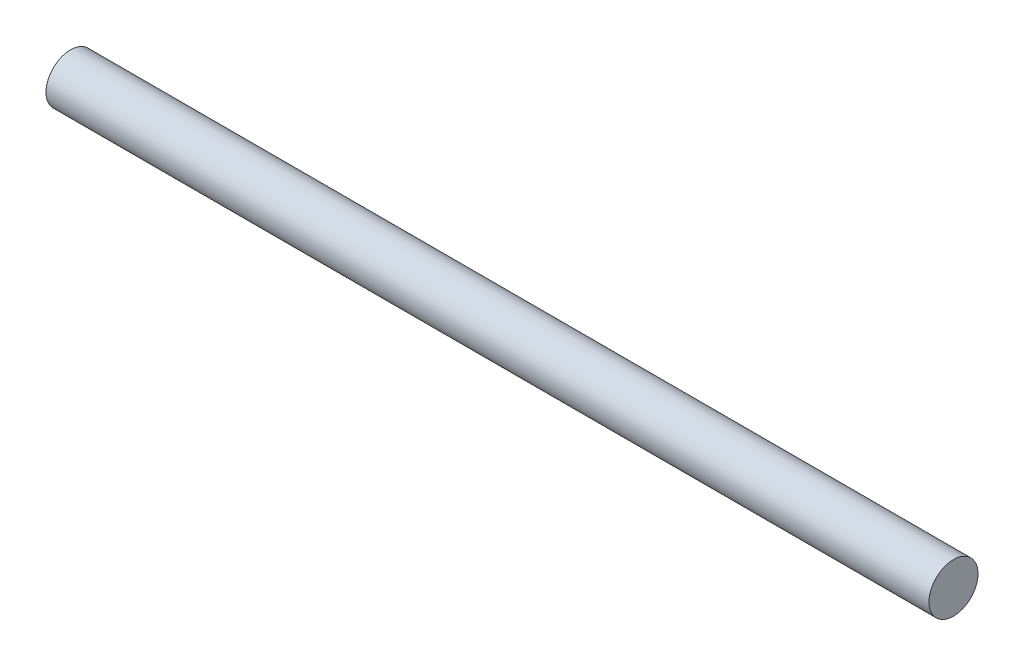
ISO-10303-21;
HEADER;
FILE_DESCRIPTION(('STEP AP214'),'2;1');
FILE_NAME('part.step','',(''),(''),'','','');
FILE_SCHEMA(('AUTOMOTIVE_DESIGN { 1 0 10303 214 1 1 1 1 }'));
ENDSEC;
DATA;
#1=APPLICATION_CONTEXT('core data for automotive mechanical design processes');
#2=APPLICATION_PROTOCOL_DEFINITION('international standard','automotive_design',2000,#1);
#3=PRODUCT_CONTEXT('',#1,'mechanical');
#4=PRODUCT('Part','Part','',(#3));
#5=PRODUCT_RELATED_PRODUCT_CATEGORY('part','',(#4));
#6=PRODUCT_DEFINITION_FORMATION('','',#4);
#7=PRODUCT_DEFINITION_CONTEXT('part definition',#1,'design');
#8=PRODUCT_DEFINITION('design','',#6,#7);
#9=PRODUCT_DEFINITION_SHAPE('','',#8);
#10=(LENGTH_UNIT() NAMED_UNIT(*) SI_UNIT(.MILLI.,.METRE.));
#11=(NAMED_UNIT(*) PLANE_ANGLE_UNIT() SI_UNIT($,.RADIAN.));
#12=(NAMED_UNIT(*) SI_UNIT($,.STERADIAN.) SOLID_ANGLE_UNIT());
#13=UNCERTAINTY_MEASURE_WITH_UNIT(LENGTH_MEASURE(1.E-05),#10,'distance_accuracy_value','');
#14=(GEOMETRIC_REPRESENTATION_CONTEXT(3) GLOBAL_UNCERTAINTY_ASSIGNED_CONTEXT((#13)) GLOBAL_UNIT_ASSIGNED_CONTEXT((#10,
#11,#12)) REPRESENTATION_CONTEXT('',''));
#15=CARTESIAN_POINT('',(0.,0.,0.));
#16=DIRECTION('',(0.,0.,1.));
#17=DIRECTION('',(1.,0.,0.));
#18=AXIS2_PLACEMENT_3D('',#15,#16,#17);
#19=CARTESIAN_POINT('',(90.,0.,0.));
#20=DIRECTION('',(-1.,0.,0.));
#21=DIRECTION('',(0.,0.,1.));
#22=AXIS2_PLACEMENT_3D('',#19,#20,#21);
#23=CYLINDRICAL_SURFACE('',#22,2.5);
#24=CARTESIAN_POINT('',(90.,0.,0.));
#25=DIRECTION('',(1.,0.,0.));
#26=DIRECTION('',(0.,0.,-1.));
#27=AXIS2_PLACEMENT_3D('',#24,#25,#26);
#28=CIRCLE('',#27,2.5);
#29=CARTESIAN_POINT('',(90.,0.,2.5));
#30=VERTEX_POINT('',#29);
#31=EDGE_CURVE('E10',#30,#30,#28,.T.);
#32=CARTESIAN_POINT('',(0.,0.,0.));
#33=DIRECTION('',(1.,0.,0.));
#34=DIRECTION('',(0.,0.,-1.));
#35=AXIS2_PLACEMENT_3D('',#32,#33,#34);
#36=CIRCLE('',#35,2.5);
#37=CARTESIAN_POINT('',(0.,0.,2.5));
#38=VERTEX_POINT('',#37);
#39=EDGE_CURVE('E34',#38,#38,#36,.T.);
#40=CARTESIAN_POINT('',(90.,0.,2.5));
#41=CARTESIAN_POINT('',(89.0625,0.,2.5));
#42=CARTESIAN_POINT('',(88.125,0.,2.5));
#43=CARTESIAN_POINT('',(86.25,0.,2.5));
#44=CARTESIAN_POINT('',(85.3125,0.,2.5));
#45=CARTESIAN_POINT('',(83.4375,0.,2.5));
#46=CARTESIAN_POINT('',(82.5,0.,2.5));
#47=CARTESIAN_POINT('',(80.625,0.,2.5));
#48=CARTESIAN_POINT('',(79.6875,0.,2.5));
#49=CARTESIAN_POINT('',(77.8125,0.,2.5));
#50=CARTESIAN_POINT('',(76.875,0.,2.5));
#51=CARTESIAN_POINT('',(75.,0.,2.5));
#52=CARTESIAN_POINT('',(74.0625,0.,2.5));
#53=CARTESIAN_POINT('',(72.1875,0.,2.5));
#54=CARTESIAN_POINT('',(71.25,0.,2.5));
#55=CARTESIAN_POINT('',(69.375,0.,2.5));
#56=CARTESIAN_POINT('',(68.4375,0.,2.5));
#57=CARTESIAN_POINT('',(66.5625,0.,2.5));
#58=CARTESIAN_POINT('',(65.625,0.,2.5));
#59=CARTESIAN_POINT('',(63.75,0.,2.5));
#60=CARTESIAN_POINT('',(62.8125,0.,2.5));
#61=CARTESIAN_POINT('',(60.9375,0.,2.5));
#62=CARTESIAN_POINT('',(60.,0.,2.5));
#63=CARTESIAN_POINT('',(58.125,0.,2.5));
#64=CARTESIAN_POINT('',(57.1875,0.,2.5));
#65=CARTESIAN_POINT('',(55.3125,0.,2.5));
#66=CARTESIAN_POINT('',(54.375,0.,2.5));
#67=CARTESIAN_POINT('',(52.5,0.,2.5));
#68=CARTESIAN_POINT('',(51.5625,0.,2.5));
#69=CARTESIAN_POINT('',(49.6875,0.,2.5));
#70=CARTESIAN_POINT('',(48.75,0.,2.5));
#71=CARTESIAN_POINT('',(46.875,0.,2.5));
#72=CARTESIAN_POINT('',(45.9375,0.,2.5));
#73=CARTESIAN_POINT('',(44.0625,0.,2.5));
#74=CARTESIAN_POINT('',(43.125,0.,2.5));
#75=CARTESIAN_POINT('',(41.25,0.,2.5));
#76=CARTESIAN_POINT('',(40.3125,0.,2.5));
#77=CARTESIAN_POINT('',(38.4375,0.,2.5));
#78=CARTESIAN_POINT('',(37.5,0.,2.5));
#79=CARTESIAN_POINT('',(35.625,0.,2.5));
#80=CARTESIAN_POINT('',(34.6875,0.,2.5));
#81=CARTESIAN_POINT('',(32.8125,0.,2.5));
#82=CARTESIAN_POINT('',(31.875,0.,2.5));
#83=CARTESIAN_POINT('',(30.,0.,2.5));
#84=CARTESIAN_POINT('',(29.0625,0.,2.5));
#85=CARTESIAN_POINT('',(27.1875,0.,2.5));
#86=CARTESIAN_POINT('',(26.25,0.,2.5));
#87=CARTESIAN_POINT('',(24.375,0.,2.5));
#88=CARTESIAN_POINT('',(23.4375,0.,2.5));
#89=CARTESIAN_POINT('',(21.5625,0.,2.5));
#90=CARTESIAN_POINT('',(20.625,0.,2.5));
#91=CARTESIAN_POINT('',(18.75,0.,2.5));
#92=CARTESIAN_POINT('',(17.8125,0.,2.5));
#93=CARTESIAN_POINT('',(15.9375,0.,2.5));
#94=CARTESIAN_POINT('',(15.,0.,2.5));
#95=CARTESIAN_POINT('',(13.125,0.,2.5));
#96=CARTESIAN_POINT('',(12.1875,0.,2.5));
#97=CARTESIAN_POINT('',(10.3125,0.,2.5));
#98=CARTESIAN_POINT('',(9.37499999999999,0.,2.5));
#99=CARTESIAN_POINT('',(7.49999999999999,0.,2.5));
#100=CARTESIAN_POINT('',(6.56249999999999,0.,2.5));
#101=CARTESIAN_POINT('',(4.68749999999999,0.,2.5));
#102=CARTESIAN_POINT('',(3.74999999999998,0.,2.5));
#103=CARTESIAN_POINT('',(1.87499999999998,0.,2.5));
#104=CARTESIAN_POINT('',(0.937499999999986,0.,2.5));
#105=CARTESIAN_POINT('',(0.,0.,2.5));
#106=B_SPLINE_CURVE_WITH_KNOTS('',3,(#40,#41,#42,#43,#44,#45,#46,#47,#48,#49,#50,#51,#52,#53,
#54,#55,#56,#57,#58,#59,#60,#61,#62,#63,#64,#65,#66,#67,#68,#69,#70,#71,#72,#73,#74,#75,#76,#77,
#78,#79,#80,#81,#82,#83,#84,#85,#86,#87,#88,#89,#90,#91,#92,#93,#94,#95,#96,#97,#98,#99,#100,
#101,#102,#103,#104,#105),.UNSPECIFIED.,.F.,.F.,(4,2,2,2,2,2,2,2,2,2,2,2,2,2,2,2,2,2,2,2,2,2,2,
2,2,2,2,2,2,2,2,2,4),(0.,2.81250000000001,5.62500000000001,8.43750000000001,11.25,14.0625,
16.875,19.6875,22.5,25.3125,28.125,30.9375,33.75,36.5625,39.375,42.1875,45.,47.8125,50.625,
53.4375,56.25,59.0625,61.875,64.6875,67.5,70.3125,73.125,75.9375,78.75,81.5625,84.375,87.1875,
90.),.UNSPECIFIED.);
#107=EDGE_CURVE('BSEAM31',#30,#38,#106,.T.);
#108=ORIENTED_EDGE('',*,*,#31,.F.);
#109=ORIENTED_EDGE('',*,*,#39,.T.);
#110=ORIENTED_EDGE('',*,*,#107,.T.);
#111=ORIENTED_EDGE('',*,*,#107,.F.);
#112=EDGE_LOOP('',(#108,#110,#109,#111));
#113=FACE_BOUND('',#112,.T.);
#114=ADVANCED_FACE('F31',(#113),#23,.T.);
#115=CARTESIAN_POINT('',(90.,0.,0.));
#116=DIRECTION('',(1.,0.,0.));
#117=DIRECTION('',(0.,0.,-1.));
#118=AXIS2_PLACEMENT_3D('',#115,#116,#117);
#119=PLANE('',#118);
#120=ORIENTED_EDGE('',*,*,#31,.T.);
#121=EDGE_LOOP('',(#120));
#122=FACE_BOUND('',#121,.T.);
#123=ADVANCED_FACE('F46',(#122),#119,.T.);
#124=CARTESIAN_POINT('',(0.,0.,0.));
#125=DIRECTION('',(1.,0.,0.));
#126=DIRECTION('',(0.,0.,-1.));
#127=AXIS2_PLACEMENT_3D('',#124,#125,#126);
#128=PLANE('',#127);
#129=ORIENTED_EDGE('',*,*,#39,.F.);
#130=EDGE_LOOP('',(#129));
#131=FACE_BOUND('',#130,.T.);
#132=ADVANCED_FACE('F44',(#131),#128,.F.);
#133=CLOSED_SHELL('',(#114,#123,#132));
#134=MANIFOLD_SOLID_BREP('B2',#133);
#135=ADVANCED_BREP_SHAPE_REPRESENTATION('',(#18,#134),#14);
#136=SHAPE_DEFINITION_REPRESENTATION(#9,#135);
ENDSEC;
END-ISO-10303-21;
